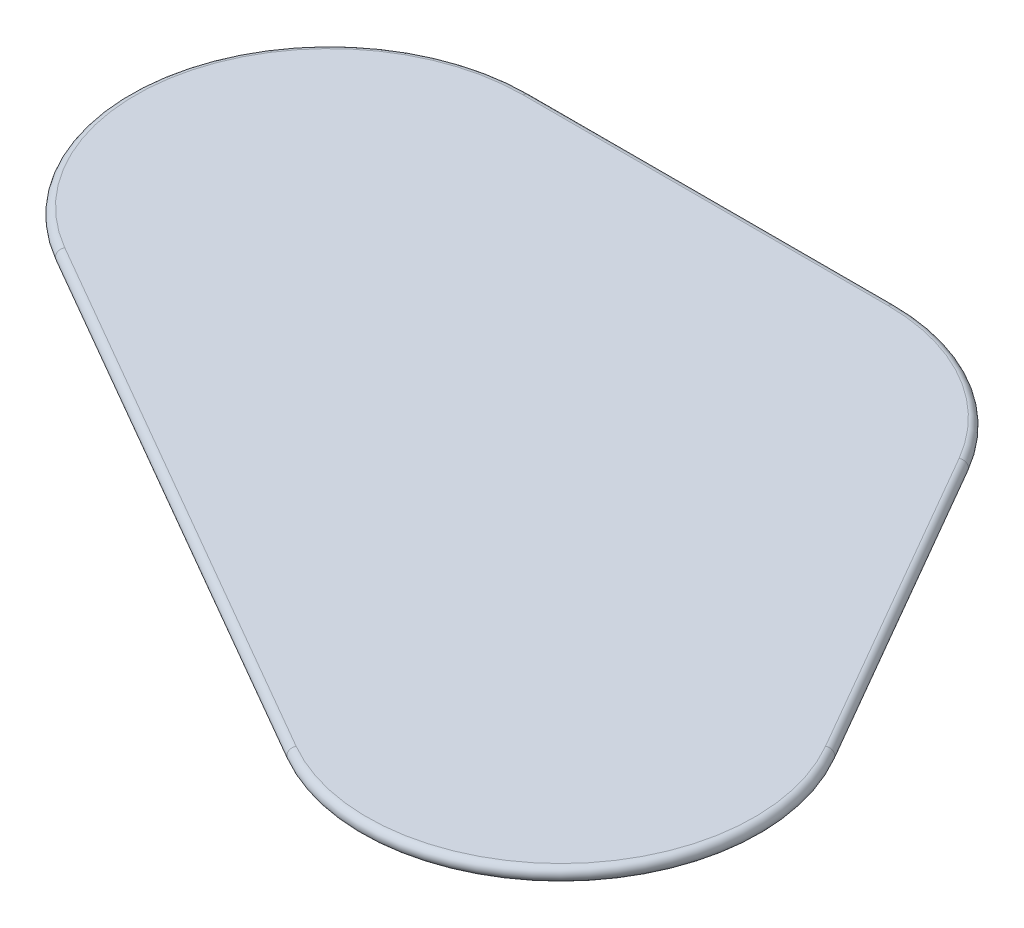
ISO-10303-21;
HEADER;
FILE_DESCRIPTION(('STEP AP214'),'2;1');
FILE_NAME('part.step','',(''),(''),'','','');
FILE_SCHEMA(('AUTOMOTIVE_DESIGN { 1 0 10303 214 1 1 1 1 }'));
ENDSEC;
DATA;
#1=APPLICATION_CONTEXT('core data for automotive mechanical design processes');
#2=APPLICATION_PROTOCOL_DEFINITION('international standard','automotive_design',2000,#1);
#3=PRODUCT_CONTEXT('',#1,'mechanical');
#4=PRODUCT('Part','Part','',(#3));
#5=PRODUCT_RELATED_PRODUCT_CATEGORY('part','',(#4));
#6=PRODUCT_DEFINITION_FORMATION('','',#4);
#7=PRODUCT_DEFINITION_CONTEXT('part definition',#1,'design');
#8=PRODUCT_DEFINITION('design','',#6,#7);
#9=PRODUCT_DEFINITION_SHAPE('','',#8);
#10=(LENGTH_UNIT() NAMED_UNIT(*) SI_UNIT(.MILLI.,.METRE.));
#11=(NAMED_UNIT(*) PLANE_ANGLE_UNIT() SI_UNIT($,.RADIAN.));
#12=(NAMED_UNIT(*) SI_UNIT($,.STERADIAN.) SOLID_ANGLE_UNIT());
#13=UNCERTAINTY_MEASURE_WITH_UNIT(LENGTH_MEASURE(1.E-05),#10,'distance_accuracy_value','');
#14=(GEOMETRIC_REPRESENTATION_CONTEXT(3) GLOBAL_UNCERTAINTY_ASSIGNED_CONTEXT((#13)) GLOBAL_UNIT_ASSIGNED_CONTEXT((#10,
#11,#12)) REPRESENTATION_CONTEXT('',''));
#15=CARTESIAN_POINT('',(0.,0.,0.));
#16=DIRECTION('',(0.,0.,1.));
#17=DIRECTION('',(1.,0.,0.));
#18=AXIS2_PLACEMENT_3D('',#15,#16,#17);
#19=CARTESIAN_POINT('',(-101.233594813038,1.5,36.7776650435133));
#20=DIRECTION('',(0.86602540378444,0.,0.499999999999998));
#21=DIRECTION('',(0.499999999999998,0.,-0.86602540378444));
#22=AXIS2_PLACEMENT_3D('',#19,#20,#21);
#23=CYLINDRICAL_SURFACE('',#22,1.5);
#24=CARTESIAN_POINT('',(18.7664051869622,1.5,106.059697346268));
#25=DIRECTION('',(0.866025403784441,0.,0.499999999999995));
#26=DIRECTION('',(0.499999999999995,0.,-0.866025403784441));
#27=AXIS2_PLACEMENT_3D('',#24,#25,#26);
#28=CIRCLE('',#27,1.5);
#29=CARTESIAN_POINT('',(18.7664051869622,3.,106.059697346268));
#30=VERTEX_POINT('',#29);
#31=CARTESIAN_POINT('',(18.7664051869622,0.,106.059697346268));
#32=VERTEX_POINT('',#31);
#33=EDGE_CURVE('E11',#30,#32,#28,.T.);
#34=ORIENTED_EDGE('',*,*,#33,.F.);
#35=DIRECTION('',(-0.86602540378444,0.,-0.499999999999998));
#36=VECTOR('',#35,1.);
#37=CARTESIAN_POINT('',(-101.233594813038,3.,36.7776650435133));
#38=LINE('',#37,#36);
#39=CARTESIAN_POINT('',(-101.233594813038,3.,36.7776650435133));
#40=VERTEX_POINT('',#39);
#41=EDGE_CURVE('E111',#40,#30,#38,.F.);
#42=ORIENTED_EDGE('',*,*,#41,.F.);
#43=CARTESIAN_POINT('',(-101.233594813038,1.5,36.7776650435133));
#44=DIRECTION('',(0.866025403784438,0.,0.500000000000001));
#45=DIRECTION('',(0.500000000000001,0.,-0.866025403784438));
#46=AXIS2_PLACEMENT_3D('',#43,#44,#45);
#47=CIRCLE('',#46,1.5);
#48=CARTESIAN_POINT('',(-101.233594813038,0.,36.7776650435133));
#49=VERTEX_POINT('',#48);
#50=EDGE_CURVE('E51',#40,#49,#47,.T.);
#51=ORIENTED_EDGE('',*,*,#50,.T.);
#52=DIRECTION('',(0.86602540378444,0.,0.499999999999998));
#53=VECTOR('',#52,1.);
#54=CARTESIAN_POINT('',(-41.233594813038,0.,71.4186811948908));
#55=LINE('',#54,#53);
#56=EDGE_CURVE('E127',#32,#49,#55,.F.);
#57=ORIENTED_EDGE('',*,*,#56,.F.);
#58=EDGE_LOOP('',(#34,#42,#51,#57));
#59=FACE_BOUND('',#58,.T.);
#60=ADVANCED_FACE('F43',(#59),#23,.T.);
#61=CARTESIAN_POINT('',(-80.,1.5,0.));
#62=DIRECTION('',(0.,1.,0.));
#63=DIRECTION('',(0.,0.,1.));
#64=AXIS2_PLACEMENT_3D('',#61,#62,#63);
#65=TOROIDAL_SURFACE('',#64,42.4671896260765,1.5);
#66=ORIENTED_EDGE('',*,*,#50,.F.);
#67=CARTESIAN_POINT('',(-80.,3.,0.));
#68=DIRECTION('',(0.,1.,0.));
#69=DIRECTION('',(0.,0.,1.));
#70=AXIS2_PLACEMENT_3D('',#67,#68,#69);
#71=CIRCLE('',#70,42.4671896260765);
#72=CARTESIAN_POINT('',(-80.,3.,-42.4671896260765));
#73=VERTEX_POINT('',#72);
#74=EDGE_CURVE('E98',#73,#40,#71,.T.);
#75=ORIENTED_EDGE('',*,*,#74,.F.);
#76=CARTESIAN_POINT('',(-80.,1.5,-42.4671896260765));
#77=DIRECTION('',(-1.,0.,0.));
#78=DIRECTION('',(0.,0.,1.));
#79=AXIS2_PLACEMENT_3D('',#76,#77,#78);
#80=CIRCLE('',#79,1.5);
#81=CARTESIAN_POINT('',(-80.,0.,-42.4671896260765));
#82=VERTEX_POINT('',#81);
#83=EDGE_CURVE('E105',#73,#82,#80,.T.);
#84=ORIENTED_EDGE('',*,*,#83,.T.);
#85=CARTESIAN_POINT('',(-80.,0.,0.));
#86=DIRECTION('',(0.,1.,0.));
#87=DIRECTION('',(0.,0.,1.));
#88=AXIS2_PLACEMENT_3D('',#85,#86,#87);
#89=CIRCLE('',#88,42.4671896260765);
#90=EDGE_CURVE('E100',#49,#82,#89,.F.);
#91=ORIENTED_EDGE('',*,*,#90,.F.);
#92=EDGE_LOOP('',(#66,#75,#84,#91));
#93=FACE_BOUND('',#92,.T.);
#94=ADVANCED_FACE('F97',(#93),#65,.T.);
#95=CARTESIAN_POINT('',(0.,1.5,-42.4671896260765));
#96=DIRECTION('',(-1.,0.,0.));
#97=DIRECTION('',(0.,0.,1.));
#98=AXIS2_PLACEMENT_3D('',#95,#96,#97);
#99=CYLINDRICAL_SURFACE('',#98,1.5);
#100=ORIENTED_EDGE('',*,*,#83,.F.);
#101=DIRECTION('',(1.,0.,0.));
#102=VECTOR('',#101,1.);
#103=CARTESIAN_POINT('',(0.,3.,-42.4671896260765));
#104=LINE('',#103,#102);
#105=CARTESIAN_POINT('',(0.,3.,-42.4671896260765));
#106=VERTEX_POINT('',#105);
#107=EDGE_CURVE('E114',#106,#73,#104,.F.);
#108=ORIENTED_EDGE('',*,*,#107,.F.);
#109=CARTESIAN_POINT('',(0.,1.5,-42.4671896260765));
#110=DIRECTION('',(-1.,0.,0.));
#111=DIRECTION('',(0.,-1.,0.));
#112=AXIS2_PLACEMENT_3D('',#109,#110,#111);
#113=CIRCLE('',#112,1.5);
#114=CARTESIAN_POINT('',(0.,0.,-42.4671896260765));
#115=VERTEX_POINT('',#114);
#116=EDGE_CURVE('E144',#106,#115,#113,.T.);
#117=ORIENTED_EDGE('',*,*,#116,.T.);
#118=DIRECTION('',(-1.,0.,0.));
#119=VECTOR('',#118,1.);
#120=CARTESIAN_POINT('',(0.,0.,-42.4671896260765));
#121=LINE('',#120,#119);
#122=EDGE_CURVE('E130',#82,#115,#121,.F.);
#123=ORIENTED_EDGE('',*,*,#122,.F.);
#124=EDGE_LOOP('',(#100,#108,#117,#123));
#125=FACE_BOUND('',#124,.T.);
#126=ADVANCED_FACE('F148',(#125),#99,.T.);
#127=CARTESIAN_POINT('',(0.,1.5,0.));
#128=DIRECTION('',(0.,1.,0.));
#129=DIRECTION('',(0.,0.,1.));
#130=AXIS2_PLACEMENT_3D('',#127,#128,#129);
#131=TOROIDAL_SURFACE('',#130,42.4671896260765,1.5);
#132=ORIENTED_EDGE('',*,*,#116,.F.);
#133=CARTESIAN_POINT('',(0.,3.,0.));
#134=DIRECTION('',(0.,1.,0.));
#135=DIRECTION('',(0.,0.,1.));
#136=AXIS2_PLACEMENT_3D('',#133,#134,#135);
#137=CIRCLE('',#136,42.4671896260765);
#138=CARTESIAN_POINT('',(36.7776650435131,3.,-21.2335948130385));
#139=VERTEX_POINT('',#138);
#140=EDGE_CURVE('E120',#139,#106,#137,.T.);
#141=ORIENTED_EDGE('',*,*,#140,.F.);
#142=CARTESIAN_POINT('',(36.7776650435131,1.5,-21.2335948130385));
#143=DIRECTION('',(-0.500000000000004,0.,-0.866025403784436));
#144=DIRECTION('',(-0.866025403784436,0.,0.500000000000004));
#145=AXIS2_PLACEMENT_3D('',#142,#143,#144);
#146=CIRCLE('',#145,1.5);
#147=CARTESIAN_POINT('',(36.7776650435131,0.,-21.2335948130385));
#148=VERTEX_POINT('',#147);
#149=EDGE_CURVE('E66',#139,#148,#146,.T.);
#150=ORIENTED_EDGE('',*,*,#149,.T.);
#151=CARTESIAN_POINT('',(0.,0.,0.));
#152=DIRECTION('',(0.,1.,0.));
#153=DIRECTION('',(0.,0.,1.));
#154=AXIS2_PLACEMENT_3D('',#151,#152,#153);
#155=CIRCLE('',#154,42.4671896260765);
#156=EDGE_CURVE('E133',#115,#148,#155,.F.);
#157=ORIENTED_EDGE('',*,*,#156,.F.);
#158=EDGE_LOOP('',(#132,#141,#150,#157));
#159=FACE_BOUND('',#158,.T.);
#160=ADVANCED_FACE('F154',(#159),#131,.T.);
#161=CARTESIAN_POINT('',(76.7776650435135,1.5,48.0484374897164));
#162=DIRECTION('',(-0.500000000000005,0.,-0.866025403784436));
#163=DIRECTION('',(-0.866025403784436,0.,0.500000000000005));
#164=AXIS2_PLACEMENT_3D('',#161,#162,#163);
#165=CYLINDRICAL_SURFACE('',#164,1.5);
#166=ORIENTED_EDGE('',*,*,#149,.F.);
#167=DIRECTION('',(-0.500000000000005,0.,-0.866025403784436));
#168=VECTOR('',#167,1.);
#169=CARTESIAN_POINT('',(36.7776650435131,3.,-21.2335948130385));
#170=LINE('',#169,#168);
#171=CARTESIAN_POINT('',(76.7776650435135,3.,48.0484374897164));
#172=VERTEX_POINT('',#171);
#173=EDGE_CURVE('E122',#172,#139,#170,.T.);
#174=ORIENTED_EDGE('',*,*,#173,.F.);
#175=CARTESIAN_POINT('',(76.7776650435135,1.5,48.0484374897164));
#176=DIRECTION('',(-0.500000000000006,0.,-0.866025403784435));
#177=DIRECTION('',(-0.866025403784435,0.,0.500000000000006));
#178=AXIS2_PLACEMENT_3D('',#175,#176,#177);
#179=CIRCLE('',#178,1.5);
#180=CARTESIAN_POINT('',(76.7776650435135,0.,48.0484374897164));
#181=VERTEX_POINT('',#180);
#182=EDGE_CURVE('E58',#172,#181,#179,.T.);
#183=ORIENTED_EDGE('',*,*,#182,.T.);
#184=DIRECTION('',(0.500000000000005,0.,0.866025403784436));
#185=VECTOR('',#184,1.);
#186=CARTESIAN_POINT('',(76.7776650435135,0.,48.0484374897164));
#187=LINE('',#186,#185);
#188=EDGE_CURVE('E136',#148,#181,#187,.T.);
#189=ORIENTED_EDGE('',*,*,#188,.F.);
#190=EDGE_LOOP('',(#166,#174,#183,#189));
#191=FACE_BOUND('',#190,.T.);
#192=ADVANCED_FACE('F153',(#191),#165,.T.);
#193=CARTESIAN_POINT('',(40.0000000000004,1.5,69.2820323027549));
#194=DIRECTION('',(0.,1.,0.));
#195=DIRECTION('',(0.,0.,1.));
#196=AXIS2_PLACEMENT_3D('',#193,#194,#195);
#197=TOROIDAL_SURFACE('',#196,42.4671896260766,1.5);
#198=CARTESIAN_POINT('',(40.0000000000004,3.,69.2820323027549));
#199=DIRECTION('',(0.,1.,0.));
#200=DIRECTION('',(0.,0.,1.));
#201=AXIS2_PLACEMENT_3D('',#198,#199,#200);
#202=CIRCLE('',#201,42.4671896260766);
#203=EDGE_CURVE('E125',#30,#172,#202,.T.);
#204=ORIENTED_EDGE('',*,*,#203,.F.);
#205=ORIENTED_EDGE('',*,*,#33,.T.);
#206=CARTESIAN_POINT('',(40.0000000000004,0.,69.2820323027549));
#207=DIRECTION('',(0.,1.,0.));
#208=DIRECTION('',(0.,0.,1.));
#209=AXIS2_PLACEMENT_3D('',#206,#207,#208);
#210=CIRCLE('',#209,42.4671896260766);
#211=EDGE_CURVE('E139',#181,#32,#210,.F.);
#212=ORIENTED_EDGE('',*,*,#211,.F.);
#213=ORIENTED_EDGE('',*,*,#182,.F.);
#214=EDGE_LOOP('',(#204,#205,#212,#213));
#215=FACE_BOUND('',#214,.T.);
#216=ADVANCED_FACE('F152',(#215),#197,.T.);
#217=CARTESIAN_POINT('',(0.,3.,0.));
#218=DIRECTION('',(0.,1.,0.));
#219=DIRECTION('',(0.,0.,1.));
#220=AXIS2_PLACEMENT_3D('',#217,#218,#219);
#221=PLANE('',#220);
#222=ORIENTED_EDGE('',*,*,#41,.T.);
#223=ORIENTED_EDGE('',*,*,#203,.T.);
#224=ORIENTED_EDGE('',*,*,#173,.T.);
#225=ORIENTED_EDGE('',*,*,#140,.T.);
#226=ORIENTED_EDGE('',*,*,#107,.T.);
#227=ORIENTED_EDGE('',*,*,#74,.T.);
#228=EDGE_LOOP('',(#222,#223,#224,#225,#226,#227));
#229=FACE_BOUND('',#228,.T.);
#230=ADVANCED_FACE('F109',(#229),#221,.T.);
#231=CARTESIAN_POINT('',(0.,0.,0.));
#232=DIRECTION('',(0.,1.,0.));
#233=DIRECTION('',(0.,0.,1.));
#234=AXIS2_PLACEMENT_3D('',#231,#232,#233);
#235=PLANE('',#234);
#236=ORIENTED_EDGE('',*,*,#188,.T.);
#237=ORIENTED_EDGE('',*,*,#211,.T.);
#238=ORIENTED_EDGE('',*,*,#56,.T.);
#239=ORIENTED_EDGE('',*,*,#90,.T.);
#240=ORIENTED_EDGE('',*,*,#122,.T.);
#241=ORIENTED_EDGE('',*,*,#156,.T.);
#242=EDGE_LOOP('',(#236,#237,#238,#239,#240,#241));
#243=FACE_BOUND('',#242,.T.);
#244=ADVANCED_FACE('F150',(#243),#235,.F.);
#245=CLOSED_SHELL('',(#60,#94,#126,#160,#192,#216,#230,#244));
#246=MANIFOLD_SOLID_BREP('B2',#245);
#247=ADVANCED_BREP_SHAPE_REPRESENTATION('',(#18,#246),#14);
#248=SHAPE_DEFINITION_REPRESENTATION(#9,#247);
ENDSEC;
END-ISO-10303-21;
